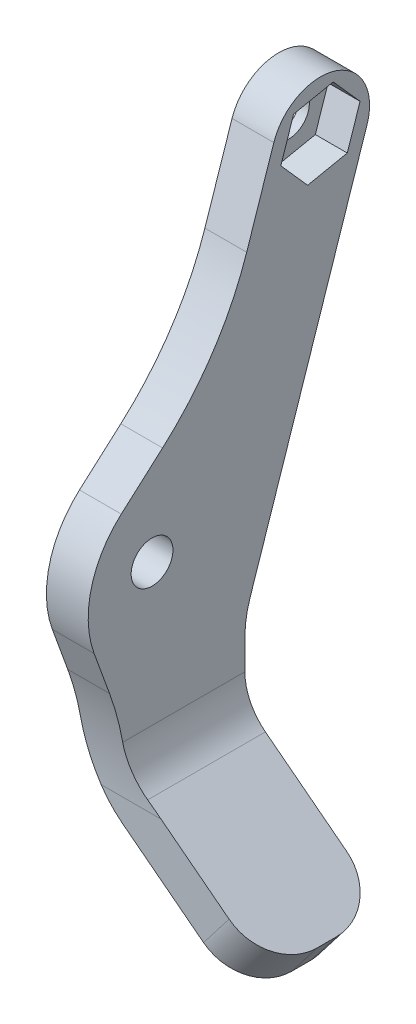
ISO-10303-21;
HEADER;
FILE_DESCRIPTION(('STEP AP214'),'2;1');
FILE_NAME('part.step','',(''),(''),'','','');
FILE_SCHEMA(('AUTOMOTIVE_DESIGN { 1 0 10303 214 1 1 1 1 }'));
ENDSEC;
DATA;
#1=APPLICATION_CONTEXT('core data for automotive mechanical design processes');
#2=APPLICATION_PROTOCOL_DEFINITION('international standard','automotive_design',2000,#1);
#3=PRODUCT_CONTEXT('',#1,'mechanical');
#4=PRODUCT('Part','Part','',(#3));
#5=PRODUCT_RELATED_PRODUCT_CATEGORY('part','',(#4));
#6=PRODUCT_DEFINITION_FORMATION('','',#4);
#7=PRODUCT_DEFINITION_CONTEXT('part definition',#1,'design');
#8=PRODUCT_DEFINITION('design','',#6,#7);
#9=PRODUCT_DEFINITION_SHAPE('','',#8);
#10=(LENGTH_UNIT() NAMED_UNIT(*) SI_UNIT(.MILLI.,.METRE.));
#11=(NAMED_UNIT(*) PLANE_ANGLE_UNIT() SI_UNIT($,.RADIAN.));
#12=(NAMED_UNIT(*) SI_UNIT($,.STERADIAN.) SOLID_ANGLE_UNIT());
#13=UNCERTAINTY_MEASURE_WITH_UNIT(LENGTH_MEASURE(1.E-05),#10,'distance_accuracy_value','');
#14=(GEOMETRIC_REPRESENTATION_CONTEXT(3) GLOBAL_UNCERTAINTY_ASSIGNED_CONTEXT((#13)) GLOBAL_UNIT_ASSIGNED_CONTEXT((#10,
#11,#12)) REPRESENTATION_CONTEXT('',''));
#15=CARTESIAN_POINT('',(0.,0.,0.));
#16=DIRECTION('',(0.,0.,1.));
#17=DIRECTION('',(1.,0.,0.));
#18=AXIS2_PLACEMENT_3D('',#15,#16,#17);
#19=CARTESIAN_POINT('',(-37.8083729395754,-70.4927189547748,-67.216498033369));
#20=DIRECTION('',(-0.611477005139686,-0.791262201918808,0.));
#21=DIRECTION('',(-0.791262201918808,0.611477005139686,0.));
#22=AXIS2_PLACEMENT_3D('',#19,#20,#21);
#23=PLANE('',#22);
#24=DIRECTION('',(0.791262201918808,-0.611477005139686,0.));
#25=VECTOR('',#24,1.);
#26=CARTESIAN_POINT('',(-37.8083729395754,-70.4927189547748,-62.432996066738));
#27=LINE('',#26,#25);
#28=CARTESIAN_POINT('',(-37.8083729395756,-70.4927189547746,-62.432996066738));
#29=VERTEX_POINT('',#28);
#30=CARTESIAN_POINT('',(-31.1979001760775,-75.6012052165714,-62.432996066738));
#31=VERTEX_POINT('',#30);
#32=EDGE_CURVE('E510',#29,#31,#27,.T.);
#33=ORIENTED_EDGE('',*,*,#32,.F.);
#34=DIRECTION('',(0.,0.,-1.));
#35=VECTOR('',#34,1.);
#36=CARTESIAN_POINT('',(-37.8083729395756,-70.4927189547746,-67.216498033369));
#37=LINE('',#36,#35);
#38=CARTESIAN_POINT('',(-37.8083729395756,-70.4927189547746,-72.));
#39=VERTEX_POINT('',#38);
#40=EDGE_CURVE('E634',#29,#39,#37,.T.);
#41=ORIENTED_EDGE('',*,*,#40,.T.);
#42=DIRECTION('',(0.791262201918808,-0.611477005139686,0.));
#43=VECTOR('',#42,1.);
#44=CARTESIAN_POINT('',(-37.8083729395754,-70.4927189547748,-72.));
#45=LINE('',#44,#43);
#46=CARTESIAN_POINT('',(-31.1979001760775,-75.6012052165714,-72.));
#47=VERTEX_POINT('',#46);
#48=EDGE_CURVE('E363',#39,#47,#45,.T.);
#49=ORIENTED_EDGE('',*,*,#48,.T.);
#50=CARTESIAN_POINT('',(-31.1979001760775,-75.6012052165714,-68.));
#51=DIRECTION('',(-0.611477005139686,-0.791262201918808,0.));
#52=DIRECTION('',(0.791262201918808,-0.611477005139686,0.));
#53=AXIS2_PLACEMENT_3D('',#50,#51,#52);
#54=CIRCLE('',#53,4.);
#55=CARTESIAN_POINT('',(-28.0328513684023,-78.0471132371301,-68.));
#56=VERTEX_POINT('',#55);
#57=EDGE_CURVE('E608',#47,#56,#54,.T.);
#58=ORIENTED_EDGE('',*,*,#57,.T.);
#59=DIRECTION('',(0.,0.,-1.));
#60=VECTOR('',#59,1.);
#61=CARTESIAN_POINT('',(-28.0328513684023,-78.0471132371301,-72.));
#62=LINE('',#61,#60);
#63=CARTESIAN_POINT('',(-28.0328513684023,-78.0471132371301,-66.432996066738));
#64=VERTEX_POINT('',#63);
#65=EDGE_CURVE('E261',#64,#56,#62,.T.);
#66=ORIENTED_EDGE('',*,*,#65,.F.);
#67=CARTESIAN_POINT('',(-31.1979001760775,-75.6012052165714,-66.432996066738));
#68=DIRECTION('',(-0.611477005139686,-0.791262201918808,0.));
#69=DIRECTION('',(0.791262201918808,-0.611477005139686,0.));
#70=AXIS2_PLACEMENT_3D('',#67,#68,#69);
#71=CIRCLE('',#70,4.);
#72=EDGE_CURVE('E614',#64,#31,#71,.T.);
#73=ORIENTED_EDGE('',*,*,#72,.T.);
#74=EDGE_LOOP('',(#33,#41,#49,#58,#66,#73));
#75=FACE_BOUND('',#74,.T.);
#76=ADVANCED_FACE('F45',(#75),#23,.T.);
#77=CARTESIAN_POINT('',(-15.8,-64.4,-62.432996066738));
#78=DIRECTION('',(0.,0.,1.));
#79=DIRECTION('',(1.,0.,0.));
#80=AXIS2_PLACEMENT_3D('',#77,#78,#79);
#81=PLANE('',#80);
#82=DIRECTION('',(-0.791262201918808,0.611477005139686,0.));
#83=VECTOR('',#82,1.);
#84=CARTESIAN_POINT('',(-25.9538295509274,-75.3568217506062,-62.432996066738));
#85=LINE('',#84,#83);
#86=CARTESIAN_POINT('',(-29.1188783586026,-72.9109137300475,-62.432996066738));
#87=VERTEX_POINT('',#86);
#88=CARTESIAN_POINT('',(-34.6560666904699,-68.6318475370031,-62.432996066738));
#89=VERTEX_POINT('',#88);
#90=EDGE_CURVE('E274',#87,#89,#85,.T.);
#91=ORIENTED_EDGE('',*,*,#90,.T.);
#92=DIRECTION('',(-1.,0.,0.));
#93=VECTOR('',#92,1.);
#94=CARTESIAN_POINT('',(-40.8,-68.6318475370031,-62.432996066738));
#95=LINE('',#94,#93);
#96=CARTESIAN_POINT('',(-39.5328427948738,-68.6318475370031,-62.432996066738));
#97=VERTEX_POINT('',#96);
#98=EDGE_CURVE('E661',#89,#97,#95,.T.);
#99=ORIENTED_EDGE('',*,*,#98,.T.);
#100=CARTESIAN_POINT('',(-33.1,-64.3999999999998,-62.432996066738));
#101=DIRECTION('',(0.,0.,1.));
#102=DIRECTION('',(1.,0.,0.));
#103=AXIS2_PLACEMENT_3D('',#100,#101,#102);
#104=CIRCLE('',#103,7.7);
#105=EDGE_CURVE('E642',#97,#29,#104,.T.);
#106=ORIENTED_EDGE('',*,*,#105,.T.);
#107=ORIENTED_EDGE('',*,*,#32,.T.);
#108=DIRECTION('',(-0.611477005139684,-0.79126220191881,0.));
#109=VECTOR('',#108,1.);
#110=CARTESIAN_POINT('',(-29.1188783586026,-72.9109137300475,-62.432996066738));
#111=LINE('',#110,#109);
#112=EDGE_CURVE('E618',#31,#87,#111,.F.);
#113=ORIENTED_EDGE('',*,*,#112,.T.);
#114=EDGE_LOOP('',(#91,#99,#106,#107,#113));
#115=FACE_BOUND('',#114,.T.);
#116=ADVANCED_FACE('F582',(#115),#81,.T.);
#117=CARTESIAN_POINT('',(-40.802,-64.9734332809365,-72.));
#118=DIRECTION('',(0.,0.,-1.));
#119=DIRECTION('',(-1.,0.,0.));
#120=AXIS2_PLACEMENT_3D('',#117,#118,#119);
#121=PLANE('',#120);
#122=DIRECTION('',(0.,-1.,0.));
#123=VECTOR('',#122,1.);
#124=CARTESIAN_POINT('',(-40.8,-64.9734332809365,-72.));
#125=LINE('',#124,#123);
#126=CARTESIAN_POINT('',(-40.8,-61.9468665618732,-72.));
#127=VERTEX_POINT('',#126);
#128=CARTESIAN_POINT('',(-40.8,-64.3999999999998,-72.));
#129=VERTEX_POINT('',#128);
#130=EDGE_CURVE('E369',#127,#129,#125,.T.);
#131=ORIENTED_EDGE('',*,*,#130,.F.);
#132=DIRECTION('',(1.,0.,0.));
#133=VECTOR('',#132,1.);
#134=CARTESIAN_POINT('',(-37.4,-61.9468665618732,-72.));
#135=LINE('',#134,#133);
#136=CARTESIAN_POINT('',(-37.4,-61.9468665618732,-72.));
#137=VERTEX_POINT('',#136);
#138=EDGE_CURVE('E644',#127,#137,#135,.T.);
#139=ORIENTED_EDGE('',*,*,#138,.T.);
#140=DIRECTION('',(0.,1.,0.));
#141=VECTOR('',#140,1.);
#142=CARTESIAN_POINT('',(-37.4,-64.9734332809365,-72.));
#143=LINE('',#142,#141);
#144=CARTESIAN_POINT('',(-37.4,-64.3999999999999,-72.));
#145=VERTEX_POINT('',#144);
#146=EDGE_CURVE('E279',#145,#137,#143,.T.);
#147=ORIENTED_EDGE('',*,*,#146,.F.);
#148=CARTESIAN_POINT('',(-33.1,-64.3999999999999,-72.));
#149=DIRECTION('',(0.,0.,-1.));
#150=DIRECTION('',(-1.,0.,0.));
#151=AXIS2_PLACEMENT_3D('',#148,#149,#150);
#152=CIRCLE('',#151,4.3);
#153=CARTESIAN_POINT('',(-35.7293511221007,-67.8024274682508,-72.));
#154=VERTEX_POINT('',#153);
#155=EDGE_CURVE('E632',#145,#154,#152,.F.);
#156=ORIENTED_EDGE('',*,*,#155,.T.);
#157=DIRECTION('',(-0.791262201918808,0.611477005139686,0.));
#158=VECTOR('',#157,1.);
#159=CARTESIAN_POINT('',(-25.9538295509274,-75.3568217506062,-72.));
#160=LINE('',#159,#158);
#161=CARTESIAN_POINT('',(-29.1188783586026,-72.9109137300475,-72.));
#162=VERTEX_POINT('',#161);
#163=EDGE_CURVE('E277',#162,#154,#160,.T.);
#164=ORIENTED_EDGE('',*,*,#163,.F.);
#165=DIRECTION('',(0.611477005139684,0.79126220191881,0.));
#166=VECTOR('',#165,1.);
#167=CARTESIAN_POINT('',(-31.1979001760775,-75.6012052165714,-72.));
#168=LINE('',#167,#166);
#169=EDGE_CURVE('E610',#162,#47,#168,.F.);
#170=ORIENTED_EDGE('',*,*,#169,.T.);
#171=ORIENTED_EDGE('',*,*,#48,.F.);
#172=CARTESIAN_POINT('',(-33.1,-64.3999999999998,-72.));
#173=DIRECTION('',(0.,0.,-1.));
#174=DIRECTION('',(-1.,0.,0.));
#175=AXIS2_PLACEMENT_3D('',#172,#173,#174);
#176=CIRCLE('',#175,7.7);
#177=EDGE_CURVE('E637',#39,#129,#176,.T.);
#178=ORIENTED_EDGE('',*,*,#177,.T.);
#179=EDGE_LOOP('',(#131,#139,#147,#156,#164,#170,#171,#178));
#180=FACE_BOUND('',#179,.T.);
#181=ADVANCED_FACE('F588',(#180),#121,.T.);
#182=CARTESIAN_POINT('',(-40.802,-34.6444235050632,-72.2334658327325));
#183=DIRECTION('',(0.,-0.316156072713349,-0.948707192808441));
#184=DIRECTION('',(0.,-0.948707192808441,0.316156072713349));
#185=AXIS2_PLACEMENT_3D('',#182,#183,#184);
#186=PLANE('',#185);
#187=DIRECTION('',(0.,-0.948707192808441,0.316156072713349));
#188=VECTOR('',#187,1.);
#189=CARTESIAN_POINT('',(-40.8,-34.6444235050632,-72.2334658327325));
#190=LINE('',#189,#188);
#191=CARTESIAN_POINT('',(-40.8,-28.2803021834753,-74.3543052429918));
#192=VERTEX_POINT('',#191);
#193=CARTESIAN_POINT('',(-40.8,-34.9076169986524,-72.1457567672509));
#194=VERTEX_POINT('',#193);
#195=EDGE_CURVE('E523',#192,#194,#190,.T.);
#196=ORIENTED_EDGE('',*,*,#195,.T.);
#197=DIRECTION('',(1.,0.,0.));
#198=VECTOR('',#197,1.);
#199=CARTESIAN_POINT('',(-40.802,-34.9076169986524,-72.1457567672509));
#200=LINE('',#199,#198);
#201=CARTESIAN_POINT('',(-37.4,-34.9076169986524,-72.1457567672509));
#202=VERTEX_POINT('',#201);
#203=EDGE_CURVE('E503',#194,#202,#200,.T.);
#204=ORIENTED_EDGE('',*,*,#203,.T.);
#205=DIRECTION('',(0.,0.948707192808441,-0.316156072713349));
#206=VECTOR('',#205,1.);
#207=CARTESIAN_POINT('',(-37.4,-34.6444235050632,-72.2334658327325));
#208=LINE('',#207,#206);
#209=CARTESIAN_POINT('',(-37.4,-28.2803021834753,-74.3543052429918));
#210=VERTEX_POINT('',#209);
#211=EDGE_CURVE('E334',#202,#210,#208,.T.);
#212=ORIENTED_EDGE('',*,*,#211,.T.);
#213=DIRECTION('',(1.,0.,0.));
#214=VECTOR('',#213,1.);
#215=CARTESIAN_POINT('',(-40.802,-28.2803021834753,-74.3543052429918));
#216=LINE('',#215,#214);
#217=EDGE_CURVE('E407',#192,#210,#216,.T.);
#218=ORIENTED_EDGE('',*,*,#217,.F.);
#219=EDGE_LOOP('',(#196,#204,#212,#218));
#220=FACE_BOUND('',#219,.T.);
#221=ADVANCED_FACE('F500',(#220),#186,.F.);
#222=CARTESIAN_POINT('',(-40.802,-29.5449264743287,-78.1491340142255));
#223=DIRECTION('',(1.,0.,0.));
#224=DIRECTION('',(0.,0.,1.));
#225=AXIS2_PLACEMENT_3D('',#222,#223,#224);
#226=CYLINDRICAL_SURFACE('',#225,4.);
#227=CARTESIAN_POINT('',(-37.4,-29.5449264743287,-78.1491340142255));
#228=DIRECTION('',(-1.,0.,0.));
#229=DIRECTION('',(0.,0.,1.));
#230=AXIS2_PLACEMENT_3D('',#227,#228,#229);
#231=CIRCLE('',#230,4.);
#232=CARTESIAN_POINT('',(-37.4,-30.8095507651821,-81.9439627854593));
#233=VERTEX_POINT('',#232);
#234=EDGE_CURVE('E329',#210,#233,#231,.T.);
#235=ORIENTED_EDGE('',*,*,#234,.T.);
#236=DIRECTION('',(1.,0.,0.));
#237=VECTOR('',#236,1.);
#238=CARTESIAN_POINT('',(-40.802,-30.8095507651821,-81.9439627854593));
#239=LINE('',#238,#237);
#240=CARTESIAN_POINT('',(-40.8,-30.8095507651821,-81.9439627854593));
#241=VERTEX_POINT('',#240);
#242=EDGE_CURVE('E368',#241,#233,#239,.T.);
#243=ORIENTED_EDGE('',*,*,#242,.F.);
#244=CARTESIAN_POINT('',(-40.8,-29.5449264743287,-78.1491340142255));
#245=DIRECTION('',(1.,0.,0.));
#246=DIRECTION('',(0.,0.,-1.));
#247=AXIS2_PLACEMENT_3D('',#244,#245,#246);
#248=CIRCLE('',#247,4.);
#249=EDGE_CURVE('E398',#241,#192,#248,.T.);
#250=ORIENTED_EDGE('',*,*,#249,.T.);
#251=ORIENTED_EDGE('',*,*,#217,.T.);
#252=EDGE_LOOP('',(#235,#243,#250,#251));
#253=FACE_BOUND('',#252,.T.);
#254=ADVANCED_FACE('F506',(#253),#226,.T.);
#255=CARTESIAN_POINT('',(-40.802,-45.1135843726741,-77.1771526214959));
#256=DIRECTION('',(0.,-0.316156072713349,-0.948707192808441));
#257=DIRECTION('',(0.,-0.948707192808441,0.316156072713349));
#258=AXIS2_PLACEMENT_3D('',#255,#256,#257);
#259=PLANE('',#258);
#260=DIRECTION('',(0.,0.94870719280844,-0.31615607271335));
#261=VECTOR('',#260,1.);
#262=CARTESIAN_POINT('',(-37.4,-45.1135843726741,-77.1771526214959));
#263=LINE('',#262,#261);
#264=CARTESIAN_POINT('',(-37.4,-59.4176179801663,-72.4103424575325));
#265=VERTEX_POINT('',#264);
#266=EDGE_CURVE('E284',#265,#233,#263,.T.);
#267=ORIENTED_EDGE('',*,*,#266,.F.);
#268=DIRECTION('',(1.,0.,0.));
#269=VECTOR('',#268,1.);
#270=CARTESIAN_POINT('',(-40.8,-59.4176179801664,-72.4103424575325));
#271=LINE('',#270,#269);
#272=CARTESIAN_POINT('',(-40.8,-59.4176179801664,-72.4103424575325));
#273=VERTEX_POINT('',#272);
#274=EDGE_CURVE('E519',#265,#273,#271,.F.);
#275=ORIENTED_EDGE('',*,*,#274,.T.);
#276=DIRECTION('',(0.,-0.948707192808441,0.316156072713349));
#277=VECTOR('',#276,1.);
#278=CARTESIAN_POINT('',(-40.8,-45.1135843726741,-77.1771526214959));
#279=LINE('',#278,#277);
#280=EDGE_CURVE('E393',#241,#273,#279,.T.);
#281=ORIENTED_EDGE('',*,*,#280,.F.);
#282=ORIENTED_EDGE('',*,*,#242,.T.);
#283=EDGE_LOOP('',(#267,#275,#281,#282));
#284=FACE_BOUND('',#283,.T.);
#285=ADVANCED_FACE('F518',(#284),#259,.T.);
#286=CARTESIAN_POINT('',(-40.802,-43.2008771904526,-67.6406835772999));
#287=DIRECTION('',(0.,0.7481527869347,0.663526493368457));
#288=DIRECTION('',(1.,0.,0.));
#289=AXIS2_PLACEMENT_3D('',#286,#287,#288);
#290=PLANE('',#289);
#291=DIRECTION('',(0.,-0.663526493368457,0.7481527869347));
#292=VECTOR('',#291,1.);
#293=CARTESIAN_POINT('',(-37.4,-43.2008771904526,-67.6406835772999));
#294=LINE('',#293,#292);
#295=CARTESIAN_POINT('',(-37.4,-45.2755381399649,-65.3014199806913));
#296=VERTEX_POINT('',#295);
#297=CARTESIAN_POINT('',(-37.4,-48.2560776774386,-61.9407418708999));
#298=VERTEX_POINT('',#297);
#299=EDGE_CURVE('E484',#296,#298,#294,.T.);
#300=ORIENTED_EDGE('',*,*,#299,.F.);
#301=DIRECTION('',(1.,0.,0.));
#302=VECTOR('',#301,1.);
#303=CARTESIAN_POINT('',(-40.802,-45.2755381399649,-65.3014199806913));
#304=LINE('',#303,#302);
#305=CARTESIAN_POINT('',(-40.8,-45.2755381399649,-65.3014199806913));
#306=VERTEX_POINT('',#305);
#307=EDGE_CURVE('E543',#296,#306,#304,.F.);
#308=ORIENTED_EDGE('',*,*,#307,.T.);
#309=DIRECTION('',(0.,0.663526493368457,-0.7481527869347));
#310=VECTOR('',#309,1.);
#311=CARTESIAN_POINT('',(-40.8,-43.2008771904526,-67.6406835772999));
#312=LINE('',#311,#310);
#313=CARTESIAN_POINT('',(-40.8,-48.2560776774386,-61.9407418708999));
#314=VERTEX_POINT('',#313);
#315=EDGE_CURVE('E382',#314,#306,#312,.T.);
#316=ORIENTED_EDGE('',*,*,#315,.F.);
#317=DIRECTION('',(1.,0.,0.));
#318=VECTOR('',#317,1.);
#319=CARTESIAN_POINT('',(-40.802,-48.2560776774386,-61.9407418708999));
#320=LINE('',#319,#318);
#321=EDGE_CURVE('E648',#314,#298,#320,.T.);
#322=ORIENTED_EDGE('',*,*,#321,.T.);
#323=EDGE_LOOP('',(#300,#308,#316,#322));
#324=FACE_BOUND('',#323,.T.);
#325=ADVANCED_FACE('F765',(#324),#290,.T.);
#326=CARTESIAN_POINT('',(-40.8,-23.2949264743284,-61.5917656593506));
#327=DIRECTION('',(-1.,0.,0.));
#328=DIRECTION('',(0.,1.,0.));
#329=AXIS2_PLACEMENT_3D('',#326,#327,#328);
#330=PLANE('',#329);
#331=CARTESIAN_POINT('',(-40.8,-52.8891770708178,-64.4445885354087));
#332=DIRECTION('',(1.,0.,0.));
#333=DIRECTION('',(0.,0.,-1.));
#334=AXIS2_PLACEMENT_3D('',#331,#332,#333);
#335=CIRCLE('',#334,1.70000000000001);
#336=CARTESIAN_POINT('',(-40.8,-52.8891770708178,-66.1445885354087));
#337=VERTEX_POINT('',#336);
#338=EDGE_CURVE('E1005',#337,#337,#335,.T.);
#339=ORIENTED_EDGE('',*,*,#338,.T.);
#340=EDGE_LOOP('',(#339));
#341=FACE_BOUND('',#340,.T.);
#342=CARTESIAN_POINT('',(-40.8,-29.5449264743287,-78.1491340142255));
#343=DIRECTION('',(1.,0.,0.));
#344=DIRECTION('',(0.,0.,-1.));
#345=AXIS2_PLACEMENT_3D('',#342,#343,#344);
#346=CIRCLE('',#345,1.70000000000001);
#347=CARTESIAN_POINT('',(-40.8,-29.5449264743287,-79.8491340142255));
#348=VERTEX_POINT('',#347);
#349=EDGE_CURVE('E238',#348,#348,#346,.T.);
#350=ORIENTED_EDGE('',*,*,#349,.T.);
#351=EDGE_LOOP('',(#350));
#352=FACE_BOUND('',#351,.T.);
#353=DIRECTION('',(0.,0.,-1.));
#354=VECTOR('',#353,1.);
#355=CARTESIAN_POINT('',(-40.8,-64.3999999999998,-61.5917656593506));
#356=LINE('',#355,#354);
#357=CARTESIAN_POINT('',(-40.8,-64.3999999999998,-62.0569556506765));
#358=VERTEX_POINT('',#357);
#359=EDGE_CURVE('E640',#129,#358,#356,.F.);
#360=ORIENTED_EDGE('',*,*,#359,.T.);
#361=CARTESIAN_POINT('',(-40.8,-68.6318475370031,-38.432996066738));
#362=DIRECTION('',(-1.,0.,0.));
#363=DIRECTION('',(0.,0.,1.));
#364=AXIS2_PLACEMENT_3D('',#361,#362,#363);
#365=CIRCLE('',#364,24.);
#366=CARTESIAN_POINT('',(-40.8,-60.4233640971871,-60.9856189655998));
#367=VERTEX_POINT('',#366);
#368=EDGE_CURVE('E548',#358,#367,#365,.F.);
#369=ORIENTED_EDGE('',*,*,#368,.T.);
#370=DIRECTION('',(0.,0.939692620785908,0.342020143325669));
#371=VECTOR('',#370,1.);
#372=CARTESIAN_POINT('',(-40.8,-63.1727708464121,-61.9863211842083));
#373=LINE('',#372,#371);
#374=CARTESIAN_POINT('',(-40.8,-56.9774611195215,-59.7314128515603));
#375=VERTEX_POINT('',#374);
#376=EDGE_CURVE('E372',#367,#375,#373,.T.);
#377=ORIENTED_EDGE('',*,*,#376,.T.);
#378=CARTESIAN_POINT('',(-40.8,-54.2412999729162,-67.2489538178475));
#379=DIRECTION('',(-1.,0.,0.));
#380=DIRECTION('',(0.,0.,1.));
#381=AXIS2_PLACEMENT_3D('',#378,#379,#380);
#382=CIRCLE('',#381,8.);
#383=EDGE_CURVE('E536',#375,#314,#382,.T.);
#384=ORIENTED_EDGE('',*,*,#383,.T.);
#385=ORIENTED_EDGE('',*,*,#315,.T.);
#386=CARTESIAN_POINT('',(-40.8,-27.3198712535321,-49.3767841398483));
#387=DIRECTION('',(-1.,0.,0.));
#388=DIRECTION('',(0.,0.,1.));
#389=AXIS2_PLACEMENT_3D('',#386,#387,#388);
#390=CIRCLE('',#389,24.);
#391=EDGE_CURVE('E534',#306,#194,#390,.F.);
#392=ORIENTED_EDGE('',*,*,#391,.T.);
#393=ORIENTED_EDGE('',*,*,#195,.F.);
#394=ORIENTED_EDGE('',*,*,#249,.F.);
#395=ORIENTED_EDGE('',*,*,#280,.T.);
#396=CARTESIAN_POINT('',(-40.8,-61.9468665618732,-80.));
#397=DIRECTION('',(-1.,0.,0.));
#398=DIRECTION('',(0.,0.,1.));
#399=AXIS2_PLACEMENT_3D('',#396,#397,#398);
#400=CIRCLE('',#399,8.);
#401=EDGE_CURVE('E657',#273,#127,#400,.F.);
#402=ORIENTED_EDGE('',*,*,#401,.T.);
#403=ORIENTED_EDGE('',*,*,#130,.T.);
#404=EDGE_LOOP('',(#360,#369,#377,#384,#385,#392,#393,#394,#395,#402,#403));
#405=FACE_BOUND('',#404,.T.);
#406=ADVANCED_FACE('F522',(#341,#352,#405),#330,.T.);
#407=CARTESIAN_POINT('',(-40.802,-63.1727708464121,-61.9863211842083));
#408=DIRECTION('',(0.,-0.342020143325669,0.939692620785908));
#409=DIRECTION('',(-1.,0.,0.));
#410=AXIS2_PLACEMENT_3D('',#407,#408,#409);
#411=PLANE('',#410);
#412=ORIENTED_EDGE('',*,*,#376,.F.);
#413=DIRECTION('',(-1.,0.,0.));
#414=VECTOR('',#413,1.);
#415=CARTESIAN_POINT('',(-37.4,-60.4233640971871,-60.9856189655998));
#416=LINE('',#415,#414);
#417=CARTESIAN_POINT('',(-37.4,-60.4233640971871,-60.9856189655998));
#418=VERTEX_POINT('',#417);
#419=EDGE_CURVE('E550',#367,#418,#416,.F.);
#420=ORIENTED_EDGE('',*,*,#419,.T.);
#421=DIRECTION('',(0.,-0.939692620785908,-0.342020143325669));
#422=VECTOR('',#421,1.);
#423=CARTESIAN_POINT('',(-37.4,-63.1727708464121,-61.9863211842083));
#424=LINE('',#423,#422);
#425=CARTESIAN_POINT('',(-37.4,-56.9774611195215,-59.7314128515603));
#426=VERTEX_POINT('',#425);
#427=EDGE_CURVE('E370',#426,#418,#424,.T.);
#428=ORIENTED_EDGE('',*,*,#427,.F.);
#429=DIRECTION('',(1.,0.,0.));
#430=VECTOR('',#429,1.);
#431=CARTESIAN_POINT('',(-40.802,-56.9774611195215,-59.7314128515603));
#432=LINE('',#431,#430);
#433=EDGE_CURVE('E652',#426,#375,#432,.F.);
#434=ORIENTED_EDGE('',*,*,#433,.T.);
#435=EDGE_LOOP('',(#412,#420,#428,#434));
#436=FACE_BOUND('',#435,.T.);
#437=ADVANCED_FACE('F667',(#436),#411,.T.);
#438=CARTESIAN_POINT('',(-37.4,-48.7724632371643,-181.705350346033));
#439=DIRECTION('',(1.,0.,0.));
#440=DIRECTION('',(0.,1.,0.));
#441=AXIS2_PLACEMENT_3D('',#438,#439,#440);
#442=PLANE('',#441);
#443=CARTESIAN_POINT('',(-37.4,-52.8891770708178,-64.4445885354087));
#444=DIRECTION('',(1.,0.,0.));
#445=DIRECTION('',(0.,0.,-1.));
#446=AXIS2_PLACEMENT_3D('',#443,#444,#445);
#447=CIRCLE('',#446,1.70000000000001);
#448=CARTESIAN_POINT('',(-37.4,-52.8891770708178,-66.1445885354087));
#449=VERTEX_POINT('',#448);
#450=EDGE_CURVE('E1008',#449,#449,#447,.T.);
#451=ORIENTED_EDGE('',*,*,#450,.F.);
#452=EDGE_LOOP('',(#451));
#453=FACE_BOUND('',#452,.T.);
#454=DIRECTION('',(0.,0.200554405873706,-0.979682566081812));
#455=VECTOR('',#454,1.);
#456=CARTESIAN_POINT('',(-37.4,-32.6670236872841,-77.1086970902097));
#457=LINE('',#456,#455);
#458=CARTESIAN_POINT('',(-37.4,-32.6670236872841,-77.1086970902097));
#459=VERTEX_POINT('',#458);
#460=CARTESIAN_POINT('',(-37.4,-32.0070198880395,-80.3327310517217));
#461=VERTEX_POINT('',#460);
#462=EDGE_CURVE('E214',#459,#461,#457,.T.);
#463=ORIENTED_EDGE('',*,*,#462,.F.);
#464=DIRECTION('',(0.,-0.748152786934705,-0.663526493368451));
#465=VECTOR('',#464,1.);
#466=CARTESIAN_POINT('',(-37.4,-30.2049302735733,-74.9251000527136));
#467=LINE('',#466,#465);
#468=CARTESIAN_POINT('',(-37.4,-30.2049302735733,-74.9251000527136));
#469=VERTEX_POINT('',#468);
#470=EDGE_CURVE('E232',#469,#459,#467,.T.);
#471=ORIENTED_EDGE('',*,*,#470,.F.);
#472=DIRECTION('',(0.,-0.948707192808439,0.316156072713355));
#473=VECTOR('',#472,1.);
#474=CARTESIAN_POINT('',(-37.4,-27.0828330606179,-75.9655369767294));
#475=LINE('',#474,#473);
#476=CARTESIAN_POINT('',(-37.4,-27.0828330606179,-75.9655369767294));
#477=VERTEX_POINT('',#476);
#478=EDGE_CURVE('E235',#477,#469,#475,.T.);
#479=ORIENTED_EDGE('',*,*,#478,.F.);
#480=DIRECTION('',(0.,-0.200554405873742,0.979682566081805));
#481=VECTOR('',#480,1.);
#482=CARTESIAN_POINT('',(-37.4,-26.4228292613732,-79.1895709382413));
#483=LINE('',#482,#481);
#484=CARTESIAN_POINT('',(-37.4,-26.4228292613732,-79.1895709382413));
#485=VERTEX_POINT('',#484);
#486=EDGE_CURVE('E254',#485,#477,#483,.T.);
#487=ORIENTED_EDGE('',*,*,#486,.F.);
#488=DIRECTION('',(0.,0.748152786934693,0.663526493368464));
#489=VECTOR('',#488,1.);
#490=CARTESIAN_POINT('',(-37.4,-28.884922675084,-81.3731679757375));
#491=LINE('',#490,#489);
#492=CARTESIAN_POINT('',(-37.4,-28.884922675084,-81.3731679757375));
#493=VERTEX_POINT('',#492);
#494=EDGE_CURVE('E251',#493,#485,#491,.T.);
#495=ORIENTED_EDGE('',*,*,#494,.F.);
#496=DIRECTION('',(0.,0.948707192808443,-0.316156072713342));
#497=VECTOR('',#496,1.);
#498=CARTESIAN_POINT('',(-37.4,-32.0070198880395,-80.3327310517217));
#499=LINE('',#498,#497);
#500=EDGE_CURVE('E249',#461,#493,#499,.T.);
#501=ORIENTED_EDGE('',*,*,#500,.F.);
#502=EDGE_LOOP('',(#463,#471,#479,#487,#495,#501));
#503=FACE_BOUND('',#502,.T.);
#504=ORIENTED_EDGE('',*,*,#211,.F.);
#505=CARTESIAN_POINT('',(-37.4,-27.3198712535321,-49.3767841398483));
#506=DIRECTION('',(1.,0.,0.));
#507=DIRECTION('',(0.,0.,-1.));
#508=AXIS2_PLACEMENT_3D('',#505,#506,#507);
#509=CIRCLE('',#508,24.);
#510=EDGE_CURVE('E545',#202,#296,#509,.F.);
#511=ORIENTED_EDGE('',*,*,#510,.T.);
#512=ORIENTED_EDGE('',*,*,#299,.T.);
#513=CARTESIAN_POINT('',(-37.4,-54.2412999729162,-67.2489538178475));
#514=DIRECTION('',(1.,0.,0.));
#515=DIRECTION('',(0.,0.,-1.));
#516=AXIS2_PLACEMENT_3D('',#513,#514,#515);
#517=CIRCLE('',#516,8.);
#518=EDGE_CURVE('E650',#298,#426,#517,.T.);
#519=ORIENTED_EDGE('',*,*,#518,.T.);
#520=ORIENTED_EDGE('',*,*,#427,.T.);
#521=CARTESIAN_POINT('',(-37.4,-68.6318475370031,-38.432996066738));
#522=DIRECTION('',(1.,0.,0.));
#523=DIRECTION('',(0.,0.,-1.));
#524=AXIS2_PLACEMENT_3D('',#521,#522,#523);
#525=CIRCLE('',#524,24.);
#526=CARTESIAN_POINT('',(-37.4,-64.3999999999999,-62.0569556506765));
#527=VERTEX_POINT('',#526);
#528=EDGE_CURVE('E671',#418,#527,#525,.F.);
#529=ORIENTED_EDGE('',*,*,#528,.T.);
#530=DIRECTION('',(0.,0.,1.));
#531=VECTOR('',#530,1.);
#532=CARTESIAN_POINT('',(-37.4,-64.3999999999999,-181.705350346033));
#533=LINE('',#532,#531);
#534=EDGE_CURVE('E61',#527,#145,#533,.F.);
#535=ORIENTED_EDGE('',*,*,#534,.T.);
#536=ORIENTED_EDGE('',*,*,#146,.T.);
#537=CARTESIAN_POINT('',(-37.4,-61.9468665618732,-80.));
#538=DIRECTION('',(1.,0.,0.));
#539=DIRECTION('',(0.,0.,-1.));
#540=AXIS2_PLACEMENT_3D('',#537,#538,#539);
#541=CIRCLE('',#540,8.);
#542=EDGE_CURVE('E513',#137,#265,#541,.F.);
#543=ORIENTED_EDGE('',*,*,#542,.T.);
#544=ORIENTED_EDGE('',*,*,#266,.T.);
#545=ORIENTED_EDGE('',*,*,#234,.F.);
#546=EDGE_LOOP('',(#504,#511,#512,#519,#520,#529,#535,#536,#543,#544,#545));
#547=FACE_BOUND('',#546,.T.);
#548=ADVANCED_FACE('F511',(#453,#503,#547),#442,.T.);
#549=CARTESIAN_POINT('',(-25.9538295509274,-75.3568217506062,-62.432996066738));
#550=DIRECTION('',(-0.611477005139686,-0.791262201918808,0.));
#551=DIRECTION('',(0.791262201918808,-0.611477005139686,0.));
#552=AXIS2_PLACEMENT_3D('',#549,#550,#551);
#553=PLANE('',#552);
#554=ORIENTED_EDGE('',*,*,#163,.T.);
#555=DIRECTION('',(0.,0.,1.));
#556=VECTOR('',#555,1.);
#557=CARTESIAN_POINT('',(-35.7293511221007,-67.8024274682508,-62.432996066738));
#558=LINE('',#557,#556);
#559=CARTESIAN_POINT('',(-35.7293511221007,-67.8024274682508,-62.4186597504794));
#560=VERTEX_POINT('',#559);
#561=EDGE_CURVE('E68',#154,#560,#558,.T.);
#562=ORIENTED_EDGE('',*,*,#561,.T.);
#563=CARTESIAN_POINT('',(-34.6560666904699,-68.6318475370031,-38.432996066738));
#564=DIRECTION('',(-0.611477005139686,-0.791262201918808,0.));
#565=DIRECTION('',(0.791262201918808,-0.611477005139686,0.));
#566=AXIS2_PLACEMENT_3D('',#563,#564,#565);
#567=ELLIPSE('',#566,39.249227359772,24.);
#568=EDGE_CURVE('E12',#560,#89,#567,.T.);
#569=ORIENTED_EDGE('',*,*,#568,.T.);
#570=ORIENTED_EDGE('',*,*,#90,.F.);
#571=CARTESIAN_POINT('',(-29.1188783586026,-72.9109137300475,-66.432996066738));
#572=DIRECTION('',(-0.611477005139686,-0.791262201918808,0.));
#573=DIRECTION('',(0.791262201918808,-0.611477005139686,0.));
#574=AXIS2_PLACEMENT_3D('',#571,#572,#573);
#575=CIRCLE('',#574,4.);
#576=CARTESIAN_POINT('',(-25.9538295509274,-75.3568217506062,-66.432996066738));
#577=VERTEX_POINT('',#576);
#578=EDGE_CURVE('E627',#87,#577,#575,.F.);
#579=ORIENTED_EDGE('',*,*,#578,.T.);
#580=DIRECTION('',(0.,0.,1.));
#581=VECTOR('',#580,1.);
#582=CARTESIAN_POINT('',(-25.9538295509274,-75.3568217506062,-62.432996066738));
#583=LINE('',#582,#581);
#584=CARTESIAN_POINT('',(-25.9538295509274,-75.3568217506062,-68.));
#585=VERTEX_POINT('',#584);
#586=EDGE_CURVE('E271',#585,#577,#583,.T.);
#587=ORIENTED_EDGE('',*,*,#586,.F.);
#588=CARTESIAN_POINT('',(-29.1188783586026,-72.9109137300475,-68.));
#589=DIRECTION('',(-0.611477005139686,-0.791262201918808,0.));
#590=DIRECTION('',(0.791262201918808,-0.611477005139686,0.));
#591=AXIS2_PLACEMENT_3D('',#588,#589,#590);
#592=CIRCLE('',#591,4.);
#593=EDGE_CURVE('E625',#585,#162,#592,.F.);
#594=ORIENTED_EDGE('',*,*,#593,.T.);
#595=EDGE_LOOP('',(#554,#562,#569,#570,#579,#587,#594));
#596=FACE_BOUND('',#595,.T.);
#597=ADVANCED_FACE('F688',(#596),#553,.F.);
#598=CARTESIAN_POINT('',(20.2109567150511,-15.6187610796495,0.));
#599=DIRECTION('',(-0.79126220191881,0.611477005139684,0.));
#600=DIRECTION('',(-0.611477005139684,-0.79126220191881,0.));
#601=AXIS2_PLACEMENT_3D('',#598,#599,#600);
#602=PLANE('',#601);
#603=ORIENTED_EDGE('',*,*,#586,.T.);
#604=DIRECTION('',(-0.611477005139684,-0.79126220191881,0.));
#605=VECTOR('',#604,1.);
#606=CARTESIAN_POINT('',(-28.0328513684023,-78.0471132371301,-66.432996066738));
#607=LINE('',#606,#605);
#608=EDGE_CURVE('E615',#577,#64,#607,.T.);
#609=ORIENTED_EDGE('',*,*,#608,.T.);
#610=ORIENTED_EDGE('',*,*,#65,.T.);
#611=DIRECTION('',(0.611477005139684,0.79126220191881,0.));
#612=VECTOR('',#611,1.);
#613=CARTESIAN_POINT('',(-25.9538295509274,-75.3568217506062,-68.));
#614=LINE('',#613,#612);
#615=EDGE_CURVE('E612',#56,#585,#614,.T.);
#616=ORIENTED_EDGE('',*,*,#615,.T.);
#617=EDGE_LOOP('',(#603,#609,#610,#616));
#618=FACE_BOUND('',#617,.T.);
#619=ADVANCED_FACE('F694',(#618),#602,.F.);
#620=CARTESIAN_POINT('',(-40.,-32.6670236872841,-77.1086970902097));
#621=DIRECTION('',(0.,-0.979682566081812,-0.200554405873706));
#622=DIRECTION('',(0.,0.200554405873706,-0.979682566081812));
#623=AXIS2_PLACEMENT_3D('',#620,#621,#622);
#624=PLANE('',#623);
#625=ORIENTED_EDGE('',*,*,#462,.T.);
#626=DIRECTION('',(1.,0.,0.));
#627=VECTOR('',#626,1.);
#628=CARTESIAN_POINT('',(-40.,-32.0070198880395,-80.3327310517217));
#629=LINE('',#628,#627);
#630=CARTESIAN_POINT('',(-40.,-32.0070198880395,-80.3327310517217));
#631=VERTEX_POINT('',#630);
#632=EDGE_CURVE('E207',#631,#461,#629,.T.);
#633=ORIENTED_EDGE('',*,*,#632,.F.);
#634=DIRECTION('',(0.,0.200554405873706,-0.979682566081812));
#635=VECTOR('',#634,1.);
#636=CARTESIAN_POINT('',(-40.,-32.6670236872841,-77.1086970902097));
#637=LINE('',#636,#635);
#638=CARTESIAN_POINT('',(-40.,-32.6670236872841,-77.1086970902097));
#639=VERTEX_POINT('',#638);
#640=EDGE_CURVE('E211',#639,#631,#637,.T.);
#641=ORIENTED_EDGE('',*,*,#640,.F.);
#642=DIRECTION('',(1.,0.,0.));
#643=VECTOR('',#642,1.);
#644=CARTESIAN_POINT('',(-40.,-32.6670236872841,-77.1086970902097));
#645=LINE('',#644,#643);
#646=EDGE_CURVE('E259',#639,#459,#645,.T.);
#647=ORIENTED_EDGE('',*,*,#646,.T.);
#648=EDGE_LOOP('',(#625,#633,#641,#647));
#649=FACE_BOUND('',#648,.T.);
#650=ADVANCED_FACE('F209',(#649),#624,.F.);
#651=CARTESIAN_POINT('',(-40.,-30.2049302735733,-74.9251000527136));
#652=DIRECTION('',(0.,-0.663526493368451,0.748152786934705));
#653=DIRECTION('',(0.,-0.748152786934705,-0.663526493368451));
#654=AXIS2_PLACEMENT_3D('',#651,#652,#653);
#655=PLANE('',#654);
#656=ORIENTED_EDGE('',*,*,#470,.T.);
#657=ORIENTED_EDGE('',*,*,#646,.F.);
#658=DIRECTION('',(0.,-0.748152786934705,-0.663526493368451));
#659=VECTOR('',#658,1.);
#660=CARTESIAN_POINT('',(-40.,-30.2049302735733,-74.9251000527136));
#661=LINE('',#660,#659);
#662=CARTESIAN_POINT('',(-40.,-30.2049302735733,-74.9251000527136));
#663=VERTEX_POINT('',#662);
#664=EDGE_CURVE('E219',#663,#639,#661,.T.);
#665=ORIENTED_EDGE('',*,*,#664,.F.);
#666=DIRECTION('',(1.,0.,0.));
#667=VECTOR('',#666,1.);
#668=CARTESIAN_POINT('',(-40.,-30.2049302735733,-74.9251000527136));
#669=LINE('',#668,#667);
#670=EDGE_CURVE('E262',#663,#469,#669,.T.);
#671=ORIENTED_EDGE('',*,*,#670,.T.);
#672=EDGE_LOOP('',(#656,#657,#665,#671));
#673=FACE_BOUND('',#672,.T.);
#674=ADVANCED_FACE('F831',(#673),#655,.F.);
#675=CARTESIAN_POINT('',(-40.,-27.0828330606179,-75.9655369767294));
#676=DIRECTION('',(0.,0.316156072713355,0.948707192808439));
#677=DIRECTION('',(0.,-0.948707192808439,0.316156072713355));
#678=AXIS2_PLACEMENT_3D('',#675,#676,#677);
#679=PLANE('',#678);
#680=ORIENTED_EDGE('',*,*,#478,.T.);
#681=ORIENTED_EDGE('',*,*,#670,.F.);
#682=DIRECTION('',(0.,-0.948707192808439,0.316156072713355));
#683=VECTOR('',#682,1.);
#684=CARTESIAN_POINT('',(-40.,-27.0828330606179,-75.9655369767294));
#685=LINE('',#684,#683);
#686=CARTESIAN_POINT('',(-40.,-27.0828330606179,-75.9655369767294));
#687=VERTEX_POINT('',#686);
#688=EDGE_CURVE('E245',#687,#663,#685,.T.);
#689=ORIENTED_EDGE('',*,*,#688,.F.);
#690=DIRECTION('',(1.,0.,0.));
#691=VECTOR('',#690,1.);
#692=CARTESIAN_POINT('',(-40.,-27.0828330606179,-75.9655369767294));
#693=LINE('',#692,#691);
#694=EDGE_CURVE('E264',#687,#477,#693,.T.);
#695=ORIENTED_EDGE('',*,*,#694,.T.);
#696=EDGE_LOOP('',(#680,#681,#689,#695));
#697=FACE_BOUND('',#696,.T.);
#698=ADVANCED_FACE('F839',(#697),#679,.F.);
#699=CARTESIAN_POINT('',(-40.,-26.4228292613732,-79.1895709382413));
#700=DIRECTION('',(0.,0.979682566081805,0.200554405873742));
#701=DIRECTION('',(0.,-0.200554405873742,0.979682566081805));
#702=AXIS2_PLACEMENT_3D('',#699,#700,#701);
#703=PLANE('',#702);
#704=ORIENTED_EDGE('',*,*,#486,.T.);
#705=ORIENTED_EDGE('',*,*,#694,.F.);
#706=DIRECTION('',(0.,-0.200554405873742,0.979682566081805));
#707=VECTOR('',#706,1.);
#708=CARTESIAN_POINT('',(-40.,-26.4228292613732,-79.1895709382413));
#709=LINE('',#708,#707);
#710=CARTESIAN_POINT('',(-40.,-26.4228292613732,-79.1895709382413));
#711=VERTEX_POINT('',#710);
#712=EDGE_CURVE('E242',#711,#687,#709,.T.);
#713=ORIENTED_EDGE('',*,*,#712,.F.);
#714=DIRECTION('',(1.,0.,0.));
#715=VECTOR('',#714,1.);
#716=CARTESIAN_POINT('',(-40.,-26.4228292613732,-79.1895709382413));
#717=LINE('',#716,#715);
#718=EDGE_CURVE('E266',#711,#485,#717,.T.);
#719=ORIENTED_EDGE('',*,*,#718,.T.);
#720=EDGE_LOOP('',(#704,#705,#713,#719));
#721=FACE_BOUND('',#720,.T.);
#722=ADVANCED_FACE('F849',(#721),#703,.F.);
#723=CARTESIAN_POINT('',(-40.,-28.884922675084,-81.3731679757375));
#724=DIRECTION('',(0.,0.663526493368465,-0.748152786934693));
#725=DIRECTION('',(0.,0.748152786934694,0.663526493368465));
#726=AXIS2_PLACEMENT_3D('',#723,#724,#725);
#727=PLANE('',#726);
#728=ORIENTED_EDGE('',*,*,#494,.T.);
#729=ORIENTED_EDGE('',*,*,#718,.F.);
#730=DIRECTION('',(0.,0.748152786934693,0.663526493368464));
#731=VECTOR('',#730,1.);
#732=CARTESIAN_POINT('',(-40.,-28.884922675084,-81.3731679757375));
#733=LINE('',#732,#731);
#734=CARTESIAN_POINT('',(-40.,-28.884922675084,-81.3731679757375));
#735=VERTEX_POINT('',#734);
#736=EDGE_CURVE('E227',#735,#711,#733,.T.);
#737=ORIENTED_EDGE('',*,*,#736,.F.);
#738=DIRECTION('',(1.,0.,0.));
#739=VECTOR('',#738,1.);
#740=CARTESIAN_POINT('',(-40.,-28.884922675084,-81.3731679757375));
#741=LINE('',#740,#739);
#742=EDGE_CURVE('E218',#735,#493,#741,.T.);
#743=ORIENTED_EDGE('',*,*,#742,.T.);
#744=EDGE_LOOP('',(#728,#729,#737,#743));
#745=FACE_BOUND('',#744,.T.);
#746=ADVANCED_FACE('F859',(#745),#727,.F.);
#747=CARTESIAN_POINT('',(-40.,-32.0070198880395,-80.3327310517217));
#748=DIRECTION('',(0.,-0.316156072713342,-0.948707192808443));
#749=DIRECTION('',(0.,0.948707192808443,-0.316156072713342));
#750=AXIS2_PLACEMENT_3D('',#747,#748,#749);
#751=PLANE('',#750);
#752=ORIENTED_EDGE('',*,*,#500,.T.);
#753=ORIENTED_EDGE('',*,*,#742,.F.);
#754=DIRECTION('',(0.,0.948707192808443,-0.316156072713342));
#755=VECTOR('',#754,1.);
#756=CARTESIAN_POINT('',(-40.,-32.0070198880395,-80.3327310517217));
#757=LINE('',#756,#755);
#758=EDGE_CURVE('E222',#631,#735,#757,.T.);
#759=ORIENTED_EDGE('',*,*,#758,.F.);
#760=ORIENTED_EDGE('',*,*,#632,.T.);
#761=EDGE_LOOP('',(#752,#753,#759,#760));
#762=FACE_BOUND('',#761,.T.);
#763=ADVANCED_FACE('F223',(#762),#751,.F.);
#764=CARTESIAN_POINT('',(-40.,0.,0.));
#765=DIRECTION('',(1.,0.,0.));
#766=DIRECTION('',(0.,0.,-1.));
#767=AXIS2_PLACEMENT_3D('',#764,#765,#766);
#768=PLANE('',#767);
#769=CARTESIAN_POINT('',(-40.,-29.5449264743287,-78.1491340142255));
#770=DIRECTION('',(1.,0.,0.));
#771=DIRECTION('',(0.,0.,-1.));
#772=AXIS2_PLACEMENT_3D('',#769,#770,#771);
#773=CIRCLE('',#772,1.70000000000001);
#774=CARTESIAN_POINT('',(-40.,-29.5449264743287,-79.8491340142255));
#775=VERTEX_POINT('',#774);
#776=EDGE_CURVE('E1010',#775,#775,#773,.T.);
#777=ORIENTED_EDGE('',*,*,#776,.F.);
#778=EDGE_LOOP('',(#777));
#779=FACE_BOUND('',#778,.T.);
#780=ORIENTED_EDGE('',*,*,#640,.T.);
#781=ORIENTED_EDGE('',*,*,#758,.T.);
#782=ORIENTED_EDGE('',*,*,#736,.T.);
#783=ORIENTED_EDGE('',*,*,#712,.T.);
#784=ORIENTED_EDGE('',*,*,#688,.T.);
#785=ORIENTED_EDGE('',*,*,#664,.T.);
#786=EDGE_LOOP('',(#780,#781,#782,#783,#784,#785));
#787=FACE_BOUND('',#786,.T.);
#788=ADVANCED_FACE('F229',(#779,#787),#768,.T.);
#789=CARTESIAN_POINT('',(-40.,-29.5449264743287,-78.1491340142255));
#790=DIRECTION('',(1.,0.,0.));
#791=DIRECTION('',(0.,0.,-1.));
#792=AXIS2_PLACEMENT_3D('',#789,#790,#791);
#793=CYLINDRICAL_SURFACE('',#792,1.70000000000001);
#794=ORIENTED_EDGE('',*,*,#349,.F.);
#795=EDGE_LOOP('',(#794));
#796=FACE_BOUND('',#795,.T.);
#797=ORIENTED_EDGE('',*,*,#776,.T.);
#798=EDGE_LOOP('',(#797));
#799=FACE_BOUND('',#798,.T.);
#800=ADVANCED_FACE('F886',(#796,#799),#793,.F.);
#801=CARTESIAN_POINT('',(-37.4,-52.8891770708178,-64.4445885354087));
#802=DIRECTION('',(1.,0.,0.));
#803=DIRECTION('',(0.,0.,-1.));
#804=AXIS2_PLACEMENT_3D('',#801,#802,#803);
#805=CYLINDRICAL_SURFACE('',#804,1.70000000000001);
#806=ORIENTED_EDGE('',*,*,#338,.F.);
#807=EDGE_LOOP('',(#806));
#808=FACE_BOUND('',#807,.T.);
#809=ORIENTED_EDGE('',*,*,#450,.T.);
#810=EDGE_LOOP('',(#809));
#811=FACE_BOUND('',#810,.T.);
#812=ADVANCED_FACE('F598',(#808,#811),#805,.F.);
#813=CARTESIAN_POINT('',(17.0459079073759,-13.1728530590908,-66.432996066738));
#814=DIRECTION('',(0.611477005139684,0.79126220191881,0.));
#815=DIRECTION('',(-0.79126220191881,0.611477005139684,0.));
#816=AXIS2_PLACEMENT_3D('',#813,#814,#815);
#817=CYLINDRICAL_SURFACE('',#816,4.);
#818=ORIENTED_EDGE('',*,*,#578,.F.);
#819=ORIENTED_EDGE('',*,*,#112,.F.);
#820=ORIENTED_EDGE('',*,*,#72,.F.);
#821=ORIENTED_EDGE('',*,*,#608,.F.);
#822=EDGE_LOOP('',(#818,#819,#820,#821));
#823=FACE_BOUND('',#822,.T.);
#824=ADVANCED_FACE('F595',(#823),#817,.T.);
#825=CARTESIAN_POINT('',(17.0459079073759,-13.1728530590908,-68.));
#826=DIRECTION('',(-0.611477005139684,-0.79126220191881,0.));
#827=DIRECTION('',(0.79126220191881,-0.611477005139684,0.));
#828=AXIS2_PLACEMENT_3D('',#825,#826,#827);
#829=CYLINDRICAL_SURFACE('',#828,4.);
#830=ORIENTED_EDGE('',*,*,#57,.F.);
#831=ORIENTED_EDGE('',*,*,#169,.F.);
#832=ORIENTED_EDGE('',*,*,#593,.F.);
#833=ORIENTED_EDGE('',*,*,#615,.F.);
#834=EDGE_LOOP('',(#830,#831,#832,#833));
#835=FACE_BOUND('',#834,.T.);
#836=ADVANCED_FACE('F597',(#835),#829,.T.);
#837=CARTESIAN_POINT('',(-33.1,-64.3999999999999,-62.432996066738));
#838=DIRECTION('',(0.,0.,1.));
#839=DIRECTION('',(1.,0.,0.));
#840=AXIS2_PLACEMENT_3D('',#837,#838,#839);
#841=CYLINDRICAL_SURFACE('',#840,4.3);
#842=ORIENTED_EDGE('',*,*,#155,.F.);
#843=ORIENTED_EDGE('',*,*,#534,.F.);
#844=CARTESIAN_POINT('',(-37.4,-64.3999999999999,-62.0569556506765));
#845=CARTESIAN_POINT('',(-37.4000134457125,-64.518806677889,-62.0782469790674));
#846=CARTESIAN_POINT('',(-37.3950765521336,-64.6377813552623,-62.0986255989889));
#847=CARTESIAN_POINT('',(-37.3753153819793,-64.8752278257215,-62.137471750469));
#848=CARTESIAN_POINT('',(-37.3604904633746,-64.9936995856503,-62.1559391578426));
#849=CARTESIAN_POINT('',(-37.320980195363,-65.229204297733,-62.1908623555724));
#850=CARTESIAN_POINT('',(-37.2963016662224,-65.3462381874873,-62.2073195270637));
#851=CARTESIAN_POINT('',(-37.2372000721439,-65.5780849463557,-62.238209840454));
#852=CARTESIAN_POINT('',(-37.2027775839974,-65.6928979465053,-62.2526431020822));
#853=CARTESIAN_POINT('',(-37.1243346577179,-65.9195825650574,-62.2795191522665));
#854=CARTESIAN_POINT('',(-37.0803036172534,-66.0314507800798,-62.291959715522));
#855=CARTESIAN_POINT('',(-36.9829229918652,-66.2513164095749,-62.3148991613946));
#856=CARTESIAN_POINT('',(-36.9295695436776,-66.3593121968396,-62.3253972353039));
#857=CARTESIAN_POINT('',(-36.8139702787808,-66.5704586170057,-62.3445393015635));
#858=CARTESIAN_POINT('',(-36.751734270478,-66.6736144295909,-62.3531853130275));
#859=CARTESIAN_POINT('',(-36.6187648351049,-66.8744317562069,-62.3687777472281));
#860=CARTESIAN_POINT('',(-36.5480298139136,-66.9720922344434,-62.3757238503764));
#861=CARTESIAN_POINT('',(-36.3649078169005,-67.2037212733509,-62.3908610013461));
#862=CARTESIAN_POINT('',(-36.2480829020978,-67.3342954011355,-62.3982098805544));
#863=CARTESIAN_POINT('',(-36.0616426484472,-67.5187077000562,-62.4072473700322));
#864=CARTESIAN_POINT('',(-35.9976228842967,-67.5782748538726,-62.409929037225));
#865=CARTESIAN_POINT('',(-35.8660707367823,-67.6933999347118,-62.4147104415214));
#866=CARTESIAN_POINT('',(-35.7985388772657,-67.7489584567086,-62.4168102651161));
#867=CARTESIAN_POINT('',(-35.7293511221006,-67.8024274682508,-62.4186597504794));
#868=B_SPLINE_CURVE_WITH_KNOTS('',3,(#844,#845,#846,#847,#848,#849,#850,#851,#852,#853,#854,
#855,#856,#857,#858,#859,#860,#861,#862,#863,#864,#865,#866,#867),.UNSPECIFIED.,.F.,.F.,(4,2,2,
2,2,2,2,2,2,2,2,4),(0.,0.362000283317865,0.724024073595852,1.08579771899099,1.44754995375459,
1.80970339227991,2.17200726693367,2.53391412564561,2.89588897184385,3.42044905069931,
3.68277329760001,3.94505852906257),.UNSPECIFIED.);
#869=EDGE_CURVE('E54',#527,#560,#868,.T.);
#870=ORIENTED_EDGE('',*,*,#869,.T.);
#871=ORIENTED_EDGE('',*,*,#561,.F.);
#872=EDGE_LOOP('',(#842,#843,#870,#871));
#873=FACE_BOUND('',#872,.T.);
#874=ADVANCED_FACE('F566',(#873),#841,.F.);
#875=CARTESIAN_POINT('',(-33.1,-64.3999999999998,-67.216498033369));
#876=DIRECTION('',(0.,0.,-1.));
#877=DIRECTION('',(-1.,0.,0.));
#878=AXIS2_PLACEMENT_3D('',#875,#876,#877);
#879=CYLINDRICAL_SURFACE('',#878,7.7);
#880=ORIENTED_EDGE('',*,*,#105,.F.);
#881=CARTESIAN_POINT('',(-39.5328427948738,-68.6318475370031,-62.432996066738));
#882=CARTESIAN_POINT('',(-39.6491897132598,-68.4550405563158,-62.4330132593195));
#883=CARTESIAN_POINT('',(-39.7582052826653,-68.2733972021398,-62.4310432853991));
#884=CARTESIAN_POINT('',(-39.9609041956046,-67.9018098373792,-62.4226055294172));
#885=CARTESIAN_POINT('',(-40.0545849758223,-67.7118644457612,-62.416136996337));
#886=CARTESIAN_POINT('',(-40.2237638388864,-67.3299398493551,-62.3984027883687));
#887=CARTESIAN_POINT('',(-40.2996579578574,-67.1381302221492,-62.3872610921339));
#888=CARTESIAN_POINT('',(-40.435712029727,-66.7494054617497,-62.3598499484079));
#889=CARTESIAN_POINT('',(-40.4958758240783,-66.5524915879829,-62.3435817549863));
#890=CARTESIAN_POINT('',(-40.5895737443191,-66.1953078050714,-62.3095248924614));
#891=CARTESIAN_POINT('',(-40.6260339109476,-66.0357041896351,-62.2927134725522));
#892=CARTESIAN_POINT('',(-40.6886609381577,-65.7148889064494,-62.2556203251195));
#893=CARTESIAN_POINT('',(-40.7148281908979,-65.5536773002042,-62.2353387298516));
#894=CARTESIAN_POINT('',(-40.7572566655649,-65.2270889173748,-62.1908430913285));
#895=CARTESIAN_POINT('',(-40.7733048045317,-65.0616942853708,-62.1665572353543));
#896=CARTESIAN_POINT('',(-40.7946825278203,-64.730759925513,-62.1144173402581));
#897=CARTESIAN_POINT('',(-40.8000112239781,-64.5652201867729,-62.0865630056715));
#898=CARTESIAN_POINT('',(-40.8,-64.3999999999998,-62.0569556506765));
#899=B_SPLINE_CURVE_WITH_KNOTS('',3,(#881,#882,#883,#884,#885,#886,#887,#888,#889,#890,#891,
#892,#893,#894,#895,#896,#897,#898),.UNSPECIFIED.,.F.,.F.,(4,2,2,2,2,2,2,2,4),(0.,
0.634789664037334,1.26968532944573,1.88870770119213,2.5075787619519,3.00095641139789,
3.49431526140216,3.99774358479606,4.50121361824212),.UNSPECIFIED.);
#900=EDGE_CURVE('E544',#97,#358,#899,.T.);
#901=ORIENTED_EDGE('',*,*,#900,.T.);
#902=ORIENTED_EDGE('',*,*,#359,.F.);
#903=ORIENTED_EDGE('',*,*,#177,.F.);
#904=ORIENTED_EDGE('',*,*,#40,.F.);
#905=EDGE_LOOP('',(#880,#901,#902,#903,#904));
#906=FACE_BOUND('',#905,.T.);
#907=ADVANCED_FACE('F560',(#906),#879,.T.);
#908=CARTESIAN_POINT('',(-40.802,-61.9468665618732,-80.));
#909=DIRECTION('',(-1.,0.,0.));
#910=DIRECTION('',(0.,0.,1.));
#911=AXIS2_PLACEMENT_3D('',#908,#909,#910);
#912=CYLINDRICAL_SURFACE('',#911,8.);
#913=ORIENTED_EDGE('',*,*,#401,.F.);
#914=ORIENTED_EDGE('',*,*,#274,.F.);
#915=ORIENTED_EDGE('',*,*,#542,.F.);
#916=ORIENTED_EDGE('',*,*,#138,.F.);
#917=EDGE_LOOP('',(#913,#914,#915,#916));
#918=FACE_BOUND('',#917,.T.);
#919=ADVANCED_FACE('F565',(#918),#912,.F.);
#920=CARTESIAN_POINT('',(-40.802,-54.2412999729162,-67.2489538178475));
#921=DIRECTION('',(1.,0.,0.));
#922=DIRECTION('',(0.,0.,-1.));
#923=AXIS2_PLACEMENT_3D('',#920,#921,#922);
#924=CYLINDRICAL_SURFACE('',#923,8.);
#925=ORIENTED_EDGE('',*,*,#383,.F.);
#926=ORIENTED_EDGE('',*,*,#433,.F.);
#927=ORIENTED_EDGE('',*,*,#518,.F.);
#928=ORIENTED_EDGE('',*,*,#321,.F.);
#929=EDGE_LOOP('',(#925,#926,#927,#928));
#930=FACE_BOUND('',#929,.T.);
#931=ADVANCED_FACE('F572',(#930),#924,.T.);
#932=CARTESIAN_POINT('',(-40.802,-27.3198712535321,-49.3767841398483));
#933=DIRECTION('',(1.,0.,0.));
#934=DIRECTION('',(0.,0.,-1.));
#935=AXIS2_PLACEMENT_3D('',#932,#933,#934);
#936=CYLINDRICAL_SURFACE('',#935,24.);
#937=ORIENTED_EDGE('',*,*,#391,.F.);
#938=ORIENTED_EDGE('',*,*,#307,.F.);
#939=ORIENTED_EDGE('',*,*,#510,.F.);
#940=ORIENTED_EDGE('',*,*,#203,.F.);
#941=EDGE_LOOP('',(#937,#938,#939,#940));
#942=FACE_BOUND('',#941,.T.);
#943=ADVANCED_FACE('F542',(#942),#936,.F.);
#944=CARTESIAN_POINT('',(-15.8,-68.6318475370031,-38.432996066738));
#945=DIRECTION('',(1.,0.,0.));
#946=DIRECTION('',(0.,0.,-1.));
#947=AXIS2_PLACEMENT_3D('',#944,#945,#946);
#948=CYLINDRICAL_SURFACE('',#947,24.);
#949=ORIENTED_EDGE('',*,*,#528,.F.);
#950=ORIENTED_EDGE('',*,*,#419,.F.);
#951=ORIENTED_EDGE('',*,*,#368,.F.);
#952=ORIENTED_EDGE('',*,*,#900,.F.);
#953=ORIENTED_EDGE('',*,*,#98,.F.);
#954=ORIENTED_EDGE('',*,*,#568,.F.);
#955=ORIENTED_EDGE('',*,*,#869,.F.);
#956=EDGE_LOOP('',(#949,#950,#951,#952,#953,#954,#955));
#957=FACE_BOUND('',#956,.T.);
#958=ADVANCED_FACE('F47',(#957),#948,.F.);
#959=CLOSED_SHELL('',(#76,#116,#181,#221,#254,#285,#325,#406,#437,#548,#597,#619,#650,#674,#698,
#722,#746,#763,#788,#800,#812,#824,#836,#874,#907,#919,#931,#943,#958));
#960=MANIFOLD_SOLID_BREP('B2',#959);
#961=ADVANCED_BREP_SHAPE_REPRESENTATION('',(#18,#960),#14);
#962=SHAPE_DEFINITION_REPRESENTATION(#9,#961);
ENDSEC;
END-ISO-10303-21;
